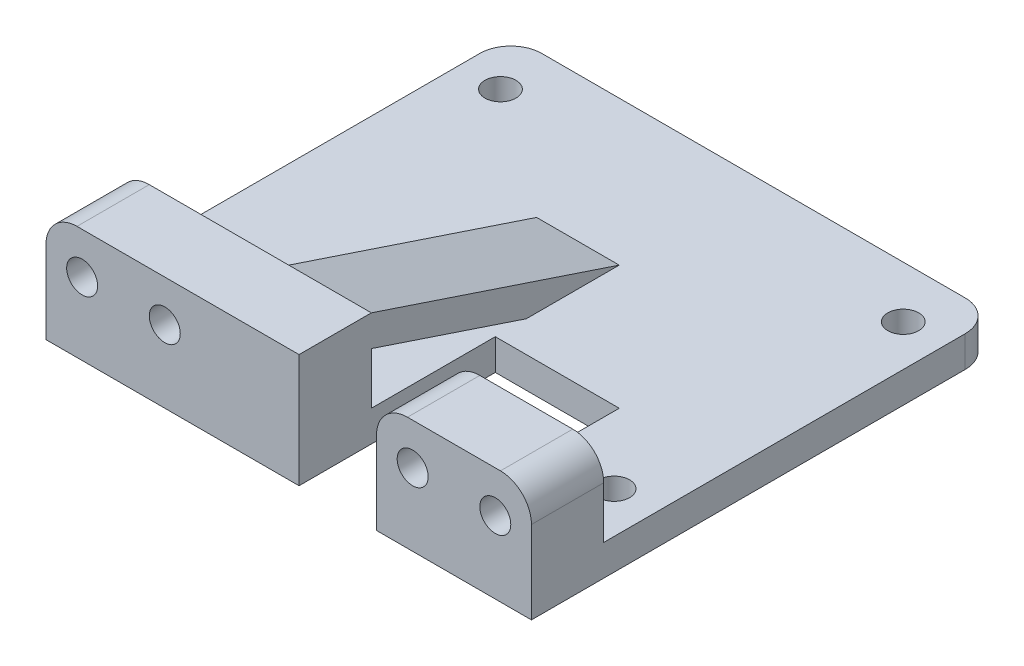
ISO-10303-21;
HEADER;
FILE_DESCRIPTION(('STEP AP214'),'2;1');
FILE_NAME('part.step','',(''),(''),'','','');
FILE_SCHEMA(('AUTOMOTIVE_DESIGN { 1 0 10303 214 1 1 1 1 }'));
ENDSEC;
DATA;
#1=APPLICATION_CONTEXT('core data for automotive mechanical design processes');
#2=APPLICATION_PROTOCOL_DEFINITION('international standard','automotive_design',2000,#1);
#3=PRODUCT_CONTEXT('',#1,'mechanical');
#4=PRODUCT('Part','Part','',(#3));
#5=PRODUCT_RELATED_PRODUCT_CATEGORY('part','',(#4));
#6=PRODUCT_DEFINITION_FORMATION('','',#4);
#7=PRODUCT_DEFINITION_CONTEXT('part definition',#1,'design');
#8=PRODUCT_DEFINITION('design','',#6,#7);
#9=PRODUCT_DEFINITION_SHAPE('','',#8);
#10=(LENGTH_UNIT() NAMED_UNIT(*) SI_UNIT(.MILLI.,.METRE.));
#11=(NAMED_UNIT(*) PLANE_ANGLE_UNIT() SI_UNIT($,.RADIAN.));
#12=(NAMED_UNIT(*) SI_UNIT($,.STERADIAN.) SOLID_ANGLE_UNIT());
#13=UNCERTAINTY_MEASURE_WITH_UNIT(LENGTH_MEASURE(1.E-05),#10,'distance_accuracy_value','');
#14=(GEOMETRIC_REPRESENTATION_CONTEXT(3) GLOBAL_UNCERTAINTY_ASSIGNED_CONTEXT((#13)) GLOBAL_UNIT_ASSIGNED_CONTEXT((#10,
#11,#12)) REPRESENTATION_CONTEXT('',''));
#15=CARTESIAN_POINT('',(0.,0.,0.));
#16=DIRECTION('',(0.,0.,1.));
#17=DIRECTION('',(1.,0.,0.));
#18=AXIS2_PLACEMENT_3D('',#15,#16,#17);
#19=CARTESIAN_POINT('',(0.,3.,7.));
#20=DIRECTION('',(0.,0.,-1.));
#21=DIRECTION('',(-1.,0.,0.));
#22=AXIS2_PLACEMENT_3D('',#19,#20,#21);
#23=PLANE('',#22);
#24=DIRECTION('',(1.,0.,0.));
#25=VECTOR('',#24,1.);
#26=CARTESIAN_POINT('',(0.,0.,7.));
#27=LINE('',#26,#25);
#28=CARTESIAN_POINT('',(0.999999999999999,0.,7.));
#29=VERTEX_POINT('',#28);
#30=CARTESIAN_POINT('',(13.,0.,7.));
#31=VERTEX_POINT('',#30);
#32=EDGE_CURVE('E307',#29,#31,#27,.T.);
#33=ORIENTED_EDGE('',*,*,#32,.T.);
#34=DIRECTION('',(0.,-1.,0.));
#35=VECTOR('',#34,1.);
#36=CARTESIAN_POINT('',(13.,3.,7.));
#37=LINE('',#36,#35);
#38=CARTESIAN_POINT('',(13.,3.,7.));
#39=VERTEX_POINT('',#38);
#40=EDGE_CURVE('E340',#39,#31,#37,.T.);
#41=ORIENTED_EDGE('',*,*,#40,.F.);
#42=DIRECTION('',(1.,0.,0.));
#43=VECTOR('',#42,1.);
#44=CARTESIAN_POINT('',(0.,3.,7.));
#45=LINE('',#44,#43);
#46=CARTESIAN_POINT('',(0.999999999999999,3.,7.));
#47=VERTEX_POINT('',#46);
#48=EDGE_CURVE('E263',#47,#39,#45,.T.);
#49=ORIENTED_EDGE('',*,*,#48,.F.);
#50=DIRECTION('',(0.,-1.,0.));
#51=VECTOR('',#50,1.);
#52=CARTESIAN_POINT('',(0.999999999999999,3.,7.));
#53=LINE('',#52,#51);
#54=EDGE_CURVE('E299',#47,#29,#53,.T.);
#55=ORIENTED_EDGE('',*,*,#54,.T.);
#56=EDGE_LOOP('',(#33,#41,#49,#55));
#57=FACE_BOUND('',#56,.T.);
#58=ADVANCED_FACE('F45',(#57),#23,.F.);
#59=CARTESIAN_POINT('',(13.,3.,0.));
#60=DIRECTION('',(1.,0.,0.));
#61=DIRECTION('',(0.,0.,-1.));
#62=AXIS2_PLACEMENT_3D('',#59,#60,#61);
#63=PLANE('',#62);
#64=DIRECTION('',(0.,0.,1.));
#65=VECTOR('',#64,1.);
#66=CARTESIAN_POINT('',(13.,0.,0.));
#67=LINE('',#66,#65);
#68=CARTESIAN_POINT('',(13.,0.,16.));
#69=VERTEX_POINT('',#68);
#70=EDGE_CURVE('E311',#31,#69,#67,.T.);
#71=ORIENTED_EDGE('',*,*,#70,.T.);
#72=DIRECTION('',(0.,-1.,0.));
#73=VECTOR('',#72,1.);
#74=CARTESIAN_POINT('',(13.,3.,16.));
#75=LINE('',#74,#73);
#76=CARTESIAN_POINT('',(13.,3.,16.));
#77=VERTEX_POINT('',#76);
#78=EDGE_CURVE('E374',#69,#77,#75,.F.);
#79=ORIENTED_EDGE('',*,*,#78,.T.);
#80=DIRECTION('',(0.,0.,1.));
#81=VECTOR('',#80,1.);
#82=CARTESIAN_POINT('',(13.,3.,0.));
#83=LINE('',#82,#81);
#84=EDGE_CURVE('E267',#39,#77,#83,.T.);
#85=ORIENTED_EDGE('',*,*,#84,.F.);
#86=ORIENTED_EDGE('',*,*,#40,.T.);
#87=EDGE_LOOP('',(#71,#79,#85,#86));
#88=FACE_BOUND('',#87,.T.);
#89=ADVANCED_FACE('F590',(#88),#63,.F.);
#90=CARTESIAN_POINT('',(23.5,3.,0.));
#91=DIRECTION('',(-1.,0.,0.));
#92=DIRECTION('',(0.,0.,1.));
#93=AXIS2_PLACEMENT_3D('',#90,#91,#92);
#94=PLANE('',#93);
#95=DIRECTION('',(0.,-1.,0.));
#96=VECTOR('',#95,1.);
#97=CARTESIAN_POINT('',(23.5,0.,19.));
#98=LINE('',#97,#96);
#99=CARTESIAN_POINT('',(23.5,8.,19.));
#100=VERTEX_POINT('',#99);
#101=CARTESIAN_POINT('',(23.5,3.,19.));
#102=VERTEX_POINT('',#101);
#103=EDGE_CURVE('E459',#100,#102,#98,.T.);
#104=ORIENTED_EDGE('',*,*,#103,.F.);
#105=DIRECTION('',(0.,0.,-1.));
#106=VECTOR('',#105,1.);
#107=CARTESIAN_POINT('',(23.5,8.,26.));
#108=LINE('',#107,#106);
#109=CARTESIAN_POINT('',(23.5,8.,26.));
#110=VERTEX_POINT('',#109);
#111=EDGE_CURVE('E11',#100,#110,#108,.F.);
#112=ORIENTED_EDGE('',*,*,#111,.T.);
#113=DIRECTION('',(0.,-1.,0.));
#114=VECTOR('',#113,1.);
#115=CARTESIAN_POINT('',(23.5,0.,26.));
#116=LINE('',#115,#114);
#117=CARTESIAN_POINT('',(23.5,0.,26.));
#118=VERTEX_POINT('',#117);
#119=EDGE_CURVE('E466',#110,#118,#116,.T.);
#120=ORIENTED_EDGE('',*,*,#119,.T.);
#121=DIRECTION('',(0.,0.,-1.));
#122=VECTOR('',#121,1.);
#123=CARTESIAN_POINT('',(23.5,0.,0.));
#124=LINE('',#123,#122);
#125=CARTESIAN_POINT('',(23.5,0.,-16.));
#126=VERTEX_POINT('',#125);
#127=EDGE_CURVE('E315',#118,#126,#124,.T.);
#128=ORIENTED_EDGE('',*,*,#127,.T.);
#129=DIRECTION('',(0.,-1.,0.));
#130=VECTOR('',#129,1.);
#131=CARTESIAN_POINT('',(23.5,3.,-16.));
#132=LINE('',#131,#130);
#133=CARTESIAN_POINT('',(23.5,3.,-16.));
#134=VERTEX_POINT('',#133);
#135=EDGE_CURVE('E357',#126,#134,#132,.F.);
#136=ORIENTED_EDGE('',*,*,#135,.T.);
#137=DIRECTION('',(0.,0.,-1.));
#138=VECTOR('',#137,1.);
#139=CARTESIAN_POINT('',(23.5,3.,0.));
#140=LINE('',#139,#138);
#141=EDGE_CURVE('E275',#102,#134,#140,.T.);
#142=ORIENTED_EDGE('',*,*,#141,.F.);
#143=EDGE_LOOP('',(#104,#112,#120,#128,#136,#142));
#144=FACE_BOUND('',#143,.T.);
#145=ADVANCED_FACE('F582',(#144),#94,.F.);
#146=CARTESIAN_POINT('',(0.,3.,-19.));
#147=DIRECTION('',(0.,0.,-1.));
#148=DIRECTION('',(-1.,0.,0.));
#149=AXIS2_PLACEMENT_3D('',#146,#147,#148);
#150=PLANE('',#149);
#151=DIRECTION('',(1.,0.,0.));
#152=VECTOR('',#151,1.);
#153=CARTESIAN_POINT('',(0.,3.,-19.));
#154=LINE('',#153,#152);
#155=CARTESIAN_POINT('',(-20.5,3.,-19.));
#156=VERTEX_POINT('',#155);
#157=CARTESIAN_POINT('',(20.5,3.,-19.));
#158=VERTEX_POINT('',#157);
#159=EDGE_CURVE('E280',#156,#158,#154,.T.);
#160=ORIENTED_EDGE('',*,*,#159,.T.);
#161=DIRECTION('',(0.,-1.,0.));
#162=VECTOR('',#161,1.);
#163=CARTESIAN_POINT('',(20.5,0.,-19.));
#164=LINE('',#163,#162);
#165=CARTESIAN_POINT('',(20.5,0.,-19.));
#166=VERTEX_POINT('',#165);
#167=EDGE_CURVE('E347',#158,#166,#164,.T.);
#168=ORIENTED_EDGE('',*,*,#167,.T.);
#169=DIRECTION('',(1.,0.,0.));
#170=VECTOR('',#169,1.);
#171=CARTESIAN_POINT('',(0.,0.,-19.));
#172=LINE('',#171,#170);
#173=CARTESIAN_POINT('',(-20.5,0.,-19.));
#174=VERTEX_POINT('',#173);
#175=EDGE_CURVE('E319',#174,#166,#172,.T.);
#176=ORIENTED_EDGE('',*,*,#175,.F.);
#177=DIRECTION('',(0.,-1.,0.));
#178=VECTOR('',#177,1.);
#179=CARTESIAN_POINT('',(-20.5,3.,-19.));
#180=LINE('',#179,#178);
#181=EDGE_CURVE('E344',#174,#156,#180,.F.);
#182=ORIENTED_EDGE('',*,*,#181,.T.);
#183=EDGE_LOOP('',(#160,#168,#176,#182));
#184=FACE_BOUND('',#183,.T.);
#185=ADVANCED_FACE('F575',(#184),#150,.T.);
#186=CARTESIAN_POINT('',(-23.5,3.,0.));
#187=DIRECTION('',(-1.,0.,0.));
#188=DIRECTION('',(0.,0.,1.));
#189=AXIS2_PLACEMENT_3D('',#186,#187,#188);
#190=PLANE('',#189);
#191=DIRECTION('',(0.,1.,0.));
#192=VECTOR('',#191,1.);
#193=CARTESIAN_POINT('',(-23.5,0.,26.));
#194=LINE('',#193,#192);
#195=CARTESIAN_POINT('',(-23.5,0.,26.));
#196=VERTEX_POINT('',#195);
#197=CARTESIAN_POINT('',(-23.5,8.,26.));
#198=VERTEX_POINT('',#197);
#199=EDGE_CURVE('E249',#196,#198,#194,.T.);
#200=ORIENTED_EDGE('',*,*,#199,.T.);
#201=DIRECTION('',(0.,0.,-1.));
#202=VECTOR('',#201,1.);
#203=CARTESIAN_POINT('',(-23.5,8.,19.));
#204=LINE('',#203,#202);
#205=CARTESIAN_POINT('',(-23.5,8.,19.));
#206=VERTEX_POINT('',#205);
#207=EDGE_CURVE('E384',#198,#206,#204,.T.);
#208=ORIENTED_EDGE('',*,*,#207,.T.);
#209=DIRECTION('',(0.,1.,0.));
#210=VECTOR('',#209,1.);
#211=CARTESIAN_POINT('',(-23.5,0.,19.));
#212=LINE('',#211,#210);
#213=CARTESIAN_POINT('',(-23.5,3.,19.));
#214=VERTEX_POINT('',#213);
#215=EDGE_CURVE('E465',#214,#206,#212,.T.);
#216=ORIENTED_EDGE('',*,*,#215,.F.);
#217=DIRECTION('',(0.,0.,-1.));
#218=VECTOR('',#217,1.);
#219=CARTESIAN_POINT('',(-23.5,3.,0.));
#220=LINE('',#219,#218);
#221=CARTESIAN_POINT('',(-23.5,3.,-16.));
#222=VERTEX_POINT('',#221);
#223=EDGE_CURVE('E284',#214,#222,#220,.T.);
#224=ORIENTED_EDGE('',*,*,#223,.T.);
#225=DIRECTION('',(0.,-1.,0.));
#226=VECTOR('',#225,1.);
#227=CARTESIAN_POINT('',(-23.5,3.,-16.));
#228=LINE('',#227,#226);
#229=CARTESIAN_POINT('',(-23.5,0.,-16.));
#230=VERTEX_POINT('',#229);
#231=EDGE_CURVE('E366',#222,#230,#228,.T.);
#232=ORIENTED_EDGE('',*,*,#231,.T.);
#233=DIRECTION('',(0.,0.,-1.));
#234=VECTOR('',#233,1.);
#235=CARTESIAN_POINT('',(-23.5,0.,0.));
#236=LINE('',#235,#234);
#237=EDGE_CURVE('E323',#196,#230,#236,.T.);
#238=ORIENTED_EDGE('',*,*,#237,.F.);
#239=EDGE_LOOP('',(#200,#208,#216,#224,#232,#238));
#240=FACE_BOUND('',#239,.T.);
#241=ADVANCED_FACE('F554',(#240),#190,.T.);
#242=CARTESIAN_POINT('',(-19.5,3.,14.));
#243=DIRECTION('',(0.,-1.,0.));
#244=DIRECTION('',(0.,0.,-1.));
#245=AXIS2_PLACEMENT_3D('',#242,#243,#244);
#246=CYLINDRICAL_SURFACE('',#245,1.5);
#247=CARTESIAN_POINT('',(-19.5,3.,14.));
#248=DIRECTION('',(0.,1.,0.));
#249=DIRECTION('',(0.,0.,1.));
#250=AXIS2_PLACEMENT_3D('',#247,#248,#249);
#251=CIRCLE('',#250,1.5);
#252=CARTESIAN_POINT('',(-19.5,3.,15.5));
#253=VERTEX_POINT('',#252);
#254=EDGE_CURVE('E291',#253,#253,#251,.T.);
#255=ORIENTED_EDGE('',*,*,#254,.T.);
#256=EDGE_LOOP('',(#255));
#257=FACE_BOUND('',#256,.T.);
#258=CARTESIAN_POINT('',(-19.5,0.,14.));
#259=DIRECTION('',(0.,1.,0.));
#260=DIRECTION('',(0.,0.,1.));
#261=AXIS2_PLACEMENT_3D('',#258,#259,#260);
#262=CIRCLE('',#261,1.5);
#263=CARTESIAN_POINT('',(-19.5,0.,15.5));
#264=VERTEX_POINT('',#263);
#265=EDGE_CURVE('E330',#264,#264,#262,.T.);
#266=ORIENTED_EDGE('',*,*,#265,.F.);
#267=EDGE_LOOP('',(#266));
#268=FACE_BOUND('',#267,.T.);
#269=ADVANCED_FACE('F668',(#257,#268),#246,.F.);
#270=CARTESIAN_POINT('',(0.999999999999999,3.,0.));
#271=DIRECTION('',(-1.,0.,0.));
#272=DIRECTION('',(0.,0.,1.));
#273=AXIS2_PLACEMENT_3D('',#270,#271,#272);
#274=PLANE('',#273);
#275=DIRECTION('',(0.,0.,-1.));
#276=VECTOR('',#275,1.);
#277=CARTESIAN_POINT('',(0.999999999999999,0.,0.));
#278=LINE('',#277,#276);
#279=CARTESIAN_POINT('',(0.999999999999999,0.,26.));
#280=VERTEX_POINT('',#279);
#281=EDGE_CURVE('E327',#280,#29,#278,.T.);
#282=ORIENTED_EDGE('',*,*,#281,.T.);
#283=ORIENTED_EDGE('',*,*,#54,.F.);
#284=DIRECTION('',(0.,0.,-1.));
#285=VECTOR('',#284,1.);
#286=CARTESIAN_POINT('',(0.999999999999999,3.,0.));
#287=LINE('',#286,#285);
#288=CARTESIAN_POINT('',(0.999999999999999,3.,19.));
#289=VERTEX_POINT('',#288);
#290=EDGE_CURVE('E288',#289,#47,#287,.T.);
#291=ORIENTED_EDGE('',*,*,#290,.F.);
#292=DIRECTION('',(0.,1.,0.));
#293=VECTOR('',#292,1.);
#294=CARTESIAN_POINT('',(0.999999999999999,0.,19.));
#295=LINE('',#294,#293);
#296=CARTESIAN_POINT('',(0.999999999999999,8.,19.));
#297=VERTEX_POINT('',#296);
#298=EDGE_CURVE('E231',#289,#297,#295,.T.);
#299=ORIENTED_EDGE('',*,*,#298,.T.);
#300=DIRECTION('',(0.,-0.316227766016838,-0.948683298050514));
#301=VECTOR('',#300,1.);
#302=CARTESIAN_POINT('',(0.999999999999999,3.,3.99999999999998));
#303=LINE('',#302,#301);
#304=CARTESIAN_POINT('',(0.999999999999999,3.,3.99999999999998));
#305=VERTEX_POINT('',#304);
#306=EDGE_CURVE('E497',#297,#305,#303,.T.);
#307=ORIENTED_EDGE('',*,*,#306,.T.);
#308=DIRECTION('',(0.,0.,-1.));
#309=VECTOR('',#308,1.);
#310=CARTESIAN_POINT('',(0.999999999999999,3.,-5.00000000000002));
#311=LINE('',#310,#309);
#312=CARTESIAN_POINT('',(0.999999999999999,3.,-5.00000000000002));
#313=VERTEX_POINT('',#312);
#314=EDGE_CURVE('E220',#305,#313,#311,.T.);
#315=ORIENTED_EDGE('',*,*,#314,.T.);
#316=DIRECTION('',(0.,0.316227766016838,0.948683298050514));
#317=VECTOR('',#316,1.);
#318=CARTESIAN_POINT('',(0.999999999999999,11.,19.));
#319=LINE('',#318,#317);
#320=CARTESIAN_POINT('',(0.999999999999999,11.,19.));
#321=VERTEX_POINT('',#320);
#322=EDGE_CURVE('E536',#313,#321,#319,.T.);
#323=ORIENTED_EDGE('',*,*,#322,.T.);
#324=DIRECTION('',(0.,0.,-1.));
#325=VECTOR('',#324,1.);
#326=CARTESIAN_POINT('',(0.999999999999999,11.,26.));
#327=LINE('',#326,#325);
#328=CARTESIAN_POINT('',(0.999999999999999,11.,26.));
#329=VERTEX_POINT('',#328);
#330=EDGE_CURVE('E236',#329,#321,#327,.T.);
#331=ORIENTED_EDGE('',*,*,#330,.F.);
#332=DIRECTION('',(0.,1.,0.));
#333=VECTOR('',#332,1.);
#334=CARTESIAN_POINT('',(0.999999999999999,0.,26.));
#335=LINE('',#334,#333);
#336=EDGE_CURVE('E474',#280,#329,#335,.T.);
#337=ORIENTED_EDGE('',*,*,#336,.F.);
#338=EDGE_LOOP('',(#282,#283,#291,#299,#307,#315,#323,#331,#337));
#339=FACE_BOUND('',#338,.T.);
#340=ADVANCED_FACE('F495',(#339),#274,.F.);
#341=CARTESIAN_POINT('',(19.5,3.,-14.));
#342=DIRECTION('',(0.,-1.,0.));
#343=DIRECTION('',(0.,0.,-1.));
#344=AXIS2_PLACEMENT_3D('',#341,#342,#343);
#345=CYLINDRICAL_SURFACE('',#344,1.5);
#346=CARTESIAN_POINT('',(19.5,3.,-14.));
#347=DIRECTION('',(0.,1.,0.));
#348=DIRECTION('',(0.,0.,1.));
#349=AXIS2_PLACEMENT_3D('',#346,#347,#348);
#350=CIRCLE('',#349,1.5);
#351=CARTESIAN_POINT('',(19.5,3.,-12.5));
#352=VERTEX_POINT('',#351);
#353=EDGE_CURVE('E258',#352,#352,#350,.T.);
#354=ORIENTED_EDGE('',*,*,#353,.T.);
#355=EDGE_LOOP('',(#354));
#356=FACE_BOUND('',#355,.T.);
#357=CARTESIAN_POINT('',(19.5,0.,-14.));
#358=DIRECTION('',(0.,1.,0.));
#359=DIRECTION('',(0.,0.,1.));
#360=AXIS2_PLACEMENT_3D('',#357,#358,#359);
#361=CIRCLE('',#360,1.5);
#362=CARTESIAN_POINT('',(19.5,0.,-12.5));
#363=VERTEX_POINT('',#362);
#364=EDGE_CURVE('E303',#363,#363,#361,.T.);
#365=ORIENTED_EDGE('',*,*,#364,.F.);
#366=EDGE_LOOP('',(#365));
#367=FACE_BOUND('',#366,.T.);
#368=ADVANCED_FACE('F609',(#356,#367),#345,.F.);
#369=CARTESIAN_POINT('',(19.5,3.,14.));
#370=DIRECTION('',(0.,-1.,0.));
#371=DIRECTION('',(0.,0.,-1.));
#372=AXIS2_PLACEMENT_3D('',#369,#370,#371);
#373=CYLINDRICAL_SURFACE('',#372,1.5);
#374=CARTESIAN_POINT('',(19.5,3.,14.));
#375=DIRECTION('',(0.,1.,0.));
#376=DIRECTION('',(0.,0.,1.));
#377=AXIS2_PLACEMENT_3D('',#374,#375,#376);
#378=CIRCLE('',#377,1.5);
#379=CARTESIAN_POINT('',(19.5,3.,15.5));
#380=VERTEX_POINT('',#379);
#381=EDGE_CURVE('E254',#380,#380,#378,.F.);
#382=ORIENTED_EDGE('',*,*,#381,.F.);
#383=EDGE_LOOP('',(#382));
#384=FACE_BOUND('',#383,.T.);
#385=CARTESIAN_POINT('',(19.5,0.,14.));
#386=DIRECTION('',(0.,1.,0.));
#387=DIRECTION('',(0.,0.,1.));
#388=AXIS2_PLACEMENT_3D('',#385,#386,#387);
#389=CIRCLE('',#388,1.5);
#390=CARTESIAN_POINT('',(19.5,0.,15.5));
#391=VERTEX_POINT('',#390);
#392=EDGE_CURVE('E252',#391,#391,#389,.F.);
#393=ORIENTED_EDGE('',*,*,#392,.T.);
#394=EDGE_LOOP('',(#393));
#395=FACE_BOUND('',#394,.T.);
#396=ADVANCED_FACE('F612',(#384,#395),#373,.F.);
#397=CARTESIAN_POINT('',(-19.5,3.,-14.));
#398=DIRECTION('',(0.,-1.,0.));
#399=DIRECTION('',(0.,0.,-1.));
#400=AXIS2_PLACEMENT_3D('',#397,#398,#399);
#401=CYLINDRICAL_SURFACE('',#400,1.5);
#402=CARTESIAN_POINT('',(-19.5,3.,-14.));
#403=DIRECTION('',(0.,1.,0.));
#404=DIRECTION('',(0.,0.,1.));
#405=AXIS2_PLACEMENT_3D('',#402,#403,#404);
#406=CIRCLE('',#405,1.5);
#407=CARTESIAN_POINT('',(-19.5,3.,-12.5));
#408=VERTEX_POINT('',#407);
#409=EDGE_CURVE('E295',#408,#408,#406,.F.);
#410=ORIENTED_EDGE('',*,*,#409,.F.);
#411=EDGE_LOOP('',(#410));
#412=FACE_BOUND('',#411,.T.);
#413=CARTESIAN_POINT('',(-19.5,0.,-14.));
#414=DIRECTION('',(0.,1.,0.));
#415=DIRECTION('',(0.,0.,1.));
#416=AXIS2_PLACEMENT_3D('',#413,#414,#415);
#417=CIRCLE('',#416,1.5);
#418=CARTESIAN_POINT('',(-19.5,0.,-12.5));
#419=VERTEX_POINT('',#418);
#420=EDGE_CURVE('E259',#419,#419,#417,.F.);
#421=ORIENTED_EDGE('',*,*,#420,.T.);
#422=EDGE_LOOP('',(#421));
#423=FACE_BOUND('',#422,.T.);
#424=ADVANCED_FACE('F616',(#412,#423),#401,.F.);
#425=CARTESIAN_POINT('',(0.,3.,0.));
#426=DIRECTION('',(0.,1.,0.));
#427=DIRECTION('',(0.,0.,1.));
#428=AXIS2_PLACEMENT_3D('',#425,#426,#427);
#429=PLANE('',#428);
#430=DIRECTION('',(0.,0.,-1.));
#431=VECTOR('',#430,1.);
#432=CARTESIAN_POINT('',(-7.,3.,-5.00000000000002));
#433=LINE('',#432,#431);
#434=CARTESIAN_POINT('',(-7.,3.,3.99999999999998));
#435=VERTEX_POINT('',#434);
#436=CARTESIAN_POINT('',(-7.,3.,-5.00000000000002));
#437=VERTEX_POINT('',#436);
#438=EDGE_CURVE('E504',#435,#437,#433,.T.);
#439=ORIENTED_EDGE('',*,*,#438,.T.);
#440=DIRECTION('',(1.,0.,0.));
#441=VECTOR('',#440,1.);
#442=CARTESIAN_POINT('',(-7.,3.,-5.00000000000002));
#443=LINE('',#442,#441);
#444=EDGE_CURVE('E218',#437,#313,#443,.T.);
#445=ORIENTED_EDGE('',*,*,#444,.T.);
#446=ORIENTED_EDGE('',*,*,#314,.F.);
#447=DIRECTION('',(1.,0.,0.));
#448=VECTOR('',#447,1.);
#449=CARTESIAN_POINT('',(-7.,3.,3.99999999999998));
#450=LINE('',#449,#448);
#451=EDGE_CURVE('E503',#435,#305,#450,.T.);
#452=ORIENTED_EDGE('',*,*,#451,.F.);
#453=EDGE_LOOP('',(#439,#445,#446,#452));
#454=FACE_BOUND('',#453,.T.);
#455=ORIENTED_EDGE('',*,*,#381,.T.);
#456=EDGE_LOOP('',(#455));
#457=FACE_BOUND('',#456,.T.);
#458=ORIENTED_EDGE('',*,*,#353,.F.);
#459=EDGE_LOOP('',(#458));
#460=FACE_BOUND('',#459,.T.);
#461=ORIENTED_EDGE('',*,*,#141,.T.);
#462=CARTESIAN_POINT('',(20.5,3.,-16.));
#463=DIRECTION('',(0.,1.,0.));
#464=DIRECTION('',(0.,0.,1.));
#465=AXIS2_PLACEMENT_3D('',#462,#463,#464);
#466=CIRCLE('',#465,3.);
#467=EDGE_CURVE('E363',#134,#158,#466,.T.);
#468=ORIENTED_EDGE('',*,*,#467,.T.);
#469=ORIENTED_EDGE('',*,*,#159,.F.);
#470=CARTESIAN_POINT('',(-20.5,3.,-16.));
#471=DIRECTION('',(0.,1.,0.));
#472=DIRECTION('',(0.,0.,1.));
#473=AXIS2_PLACEMENT_3D('',#470,#471,#472);
#474=CIRCLE('',#473,3.);
#475=EDGE_CURVE('E360',#156,#222,#474,.T.);
#476=ORIENTED_EDGE('',*,*,#475,.T.);
#477=ORIENTED_EDGE('',*,*,#223,.F.);
#478=DIRECTION('',(1.,0.,0.));
#479=VECTOR('',#478,1.);
#480=CARTESIAN_POINT('',(0.,3.,19.));
#481=LINE('',#480,#479);
#482=EDGE_CURVE('E276',#214,#289,#481,.T.);
#483=ORIENTED_EDGE('',*,*,#482,.T.);
#484=ORIENTED_EDGE('',*,*,#290,.T.);
#485=ORIENTED_EDGE('',*,*,#48,.T.);
#486=ORIENTED_EDGE('',*,*,#84,.T.);
#487=CARTESIAN_POINT('',(10.,3.,16.));
#488=DIRECTION('',(0.,1.,0.));
#489=DIRECTION('',(0.,0.,1.));
#490=AXIS2_PLACEMENT_3D('',#487,#488,#489);
#491=CIRCLE('',#490,3.);
#492=CARTESIAN_POINT('',(10.,3.,19.));
#493=VERTEX_POINT('',#492);
#494=EDGE_CURVE('E380',#77,#493,#491,.F.);
#495=ORIENTED_EDGE('',*,*,#494,.T.);
#496=EDGE_CURVE('E271',#493,#102,#481,.T.);
#497=ORIENTED_EDGE('',*,*,#496,.T.);
#498=EDGE_LOOP('',(#461,#468,#469,#476,#477,#483,#484,#485,#486,#495,#497));
#499=FACE_BOUND('',#498,.T.);
#500=ORIENTED_EDGE('',*,*,#254,.F.);
#501=EDGE_LOOP('',(#500));
#502=FACE_BOUND('',#501,.T.);
#503=ORIENTED_EDGE('',*,*,#409,.T.);
#504=EDGE_LOOP('',(#503));
#505=FACE_BOUND('',#504,.T.);
#506=ADVANCED_FACE('F542',(#454,#457,#460,#499,#502,#505),#429,.T.);
#507=CARTESIAN_POINT('',(0.,0.,0.));
#508=DIRECTION('',(0.,1.,0.));
#509=DIRECTION('',(0.,0.,1.));
#510=AXIS2_PLACEMENT_3D('',#507,#508,#509);
#511=PLANE('',#510);
#512=ORIENTED_EDGE('',*,*,#392,.F.);
#513=EDGE_LOOP('',(#512));
#514=FACE_BOUND('',#513,.T.);
#515=ORIENTED_EDGE('',*,*,#364,.T.);
#516=EDGE_LOOP('',(#515));
#517=FACE_BOUND('',#516,.T.);
#518=ORIENTED_EDGE('',*,*,#175,.T.);
#519=CARTESIAN_POINT('',(20.5,0.,-16.));
#520=DIRECTION('',(0.,1.,0.));
#521=DIRECTION('',(0.,0.,1.));
#522=AXIS2_PLACEMENT_3D('',#519,#520,#521);
#523=CIRCLE('',#522,3.);
#524=EDGE_CURVE('E354',#166,#126,#523,.F.);
#525=ORIENTED_EDGE('',*,*,#524,.T.);
#526=ORIENTED_EDGE('',*,*,#127,.F.);
#527=DIRECTION('',(-1.,0.,0.));
#528=VECTOR('',#527,1.);
#529=CARTESIAN_POINT('',(0.,0.,26.));
#530=LINE('',#529,#528);
#531=CARTESIAN_POINT('',(8.50000000000001,0.,26.));
#532=VERTEX_POINT('',#531);
#533=EDGE_CURVE('E433',#118,#532,#530,.T.);
#534=ORIENTED_EDGE('',*,*,#533,.T.);
#535=DIRECTION('',(0.,0.,-1.));
#536=VECTOR('',#535,1.);
#537=CARTESIAN_POINT('',(8.50000000000001,0.,26.));
#538=LINE('',#537,#536);
#539=CARTESIAN_POINT('',(8.50000000000001,0.,19.));
#540=VERTEX_POINT('',#539);
#541=EDGE_CURVE('E431',#532,#540,#538,.T.);
#542=ORIENTED_EDGE('',*,*,#541,.T.);
#543=DIRECTION('',(-1.,0.,0.));
#544=VECTOR('',#543,1.);
#545=CARTESIAN_POINT('',(0.,0.,19.));
#546=LINE('',#545,#544);
#547=CARTESIAN_POINT('',(10.,0.,19.));
#548=VERTEX_POINT('',#547);
#549=EDGE_CURVE('E450',#548,#540,#546,.T.);
#550=ORIENTED_EDGE('',*,*,#549,.F.);
#551=CARTESIAN_POINT('',(10.,0.,16.));
#552=DIRECTION('',(0.,1.,0.));
#553=DIRECTION('',(0.,0.,1.));
#554=AXIS2_PLACEMENT_3D('',#551,#552,#553);
#555=CIRCLE('',#554,3.);
#556=EDGE_CURVE('E377',#548,#69,#555,.T.);
#557=ORIENTED_EDGE('',*,*,#556,.T.);
#558=ORIENTED_EDGE('',*,*,#70,.F.);
#559=ORIENTED_EDGE('',*,*,#32,.F.);
#560=ORIENTED_EDGE('',*,*,#281,.F.);
#561=DIRECTION('',(1.,0.,0.));
#562=VECTOR('',#561,1.);
#563=CARTESIAN_POINT('',(0.,0.,26.));
#564=LINE('',#563,#562);
#565=EDGE_CURVE('E470',#196,#280,#564,.T.);
#566=ORIENTED_EDGE('',*,*,#565,.F.);
#567=ORIENTED_EDGE('',*,*,#237,.T.);
#568=CARTESIAN_POINT('',(-20.5,0.,-16.));
#569=DIRECTION('',(0.,1.,0.));
#570=DIRECTION('',(0.,0.,1.));
#571=AXIS2_PLACEMENT_3D('',#568,#569,#570);
#572=CIRCLE('',#571,3.);
#573=EDGE_CURVE('E351',#230,#174,#572,.F.);
#574=ORIENTED_EDGE('',*,*,#573,.T.);
#575=EDGE_LOOP('',(#518,#525,#526,#534,#542,#550,#557,#558,#559,#560,#566,#567,#574));
#576=FACE_BOUND('',#575,.T.);
#577=ORIENTED_EDGE('',*,*,#265,.T.);
#578=EDGE_LOOP('',(#577));
#579=FACE_BOUND('',#578,.T.);
#580=ORIENTED_EDGE('',*,*,#420,.F.);
#581=EDGE_LOOP('',(#580));
#582=FACE_BOUND('',#581,.T.);
#583=ADVANCED_FACE('F557',(#514,#517,#576,#579,#582),#511,.F.);
#584=CARTESIAN_POINT('',(-20.,7.,26.));
#585=DIRECTION('',(0.,0.,-1.));
#586=DIRECTION('',(-1.,0.,0.));
#587=AXIS2_PLACEMENT_3D('',#584,#585,#586);
#588=CYLINDRICAL_SURFACE('',#587,1.5);
#589=CARTESIAN_POINT('',(-20.,7.,26.));
#590=DIRECTION('',(0.,0.,1.));
#591=DIRECTION('',(1.,0.,0.));
#592=AXIS2_PLACEMENT_3D('',#589,#590,#591);
#593=CIRCLE('',#592,1.5);
#594=CARTESIAN_POINT('',(-18.5,7.,26.));
#595=VERTEX_POINT('',#594);
#596=EDGE_CURVE('E481',#595,#595,#593,.F.);
#597=ORIENTED_EDGE('',*,*,#596,.F.);
#598=EDGE_LOOP('',(#597));
#599=FACE_BOUND('',#598,.T.);
#600=CARTESIAN_POINT('',(-20.,7.,19.));
#601=DIRECTION('',(0.,0.,1.));
#602=DIRECTION('',(1.,0.,0.));
#603=AXIS2_PLACEMENT_3D('',#600,#601,#602);
#604=CIRCLE('',#603,1.5);
#605=CARTESIAN_POINT('',(-18.5,7.,19.));
#606=VERTEX_POINT('',#605);
#607=EDGE_CURVE('E238',#606,#606,#604,.F.);
#608=ORIENTED_EDGE('',*,*,#607,.T.);
#609=EDGE_LOOP('',(#608));
#610=FACE_BOUND('',#609,.T.);
#611=ADVANCED_FACE('F654',(#599,#610),#588,.F.);
#612=CARTESIAN_POINT('',(0.,11.,26.));
#613=DIRECTION('',(0.,-1.,0.));
#614=DIRECTION('',(0.,0.,-1.));
#615=AXIS2_PLACEMENT_3D('',#612,#613,#614);
#616=PLANE('',#615);
#617=DIRECTION('',(-1.,0.,0.));
#618=VECTOR('',#617,1.);
#619=CARTESIAN_POINT('',(0.,11.,19.));
#620=LINE('',#619,#618);
#621=CARTESIAN_POINT('',(-7.,11.,19.));
#622=VERTEX_POINT('',#621);
#623=CARTESIAN_POINT('',(-20.5,11.,19.));
#624=VERTEX_POINT('',#623);
#625=EDGE_CURVE('E223',#622,#624,#620,.T.);
#626=ORIENTED_EDGE('',*,*,#625,.T.);
#627=DIRECTION('',(0.,0.,-1.));
#628=VECTOR('',#627,1.);
#629=CARTESIAN_POINT('',(-20.5,11.,26.));
#630=LINE('',#629,#628);
#631=CARTESIAN_POINT('',(-20.5,11.,26.));
#632=VERTEX_POINT('',#631);
#633=EDGE_CURVE('E390',#624,#632,#630,.F.);
#634=ORIENTED_EDGE('',*,*,#633,.T.);
#635=DIRECTION('',(-1.,0.,0.));
#636=VECTOR('',#635,1.);
#637=CARTESIAN_POINT('',(0.,11.,26.));
#638=LINE('',#637,#636);
#639=EDGE_CURVE('E477',#329,#632,#638,.T.);
#640=ORIENTED_EDGE('',*,*,#639,.F.);
#641=ORIENTED_EDGE('',*,*,#330,.T.);
#642=EDGE_CURVE('E215',#321,#622,#620,.T.);
#643=ORIENTED_EDGE('',*,*,#642,.T.);
#644=EDGE_LOOP('',(#626,#634,#640,#641,#643));
#645=FACE_BOUND('',#644,.T.);
#646=ADVANCED_FACE('F233',(#645),#616,.F.);
#647=CARTESIAN_POINT('',(-12.,7.,26.));
#648=DIRECTION('',(0.,0.,-1.));
#649=DIRECTION('',(-1.,0.,0.));
#650=AXIS2_PLACEMENT_3D('',#647,#648,#649);
#651=CYLINDRICAL_SURFACE('',#650,1.5);
#652=CARTESIAN_POINT('',(-12.,7.,26.));
#653=DIRECTION('',(0.,0.,1.));
#654=DIRECTION('',(1.,0.,0.));
#655=AXIS2_PLACEMENT_3D('',#652,#653,#654);
#656=CIRCLE('',#655,1.5);
#657=CARTESIAN_POINT('',(-10.5,7.,26.));
#658=VERTEX_POINT('',#657);
#659=EDGE_CURVE('E253',#658,#658,#656,.F.);
#660=ORIENTED_EDGE('',*,*,#659,.F.);
#661=EDGE_LOOP('',(#660));
#662=FACE_BOUND('',#661,.T.);
#663=CARTESIAN_POINT('',(-12.,7.,19.));
#664=DIRECTION('',(0.,0.,1.));
#665=DIRECTION('',(1.,0.,0.));
#666=AXIS2_PLACEMENT_3D('',#663,#664,#665);
#667=CIRCLE('',#666,1.5);
#668=CARTESIAN_POINT('',(-10.5,7.,19.));
#669=VERTEX_POINT('',#668);
#670=EDGE_CURVE('E241',#669,#669,#667,.F.);
#671=ORIENTED_EDGE('',*,*,#670,.T.);
#672=EDGE_LOOP('',(#671));
#673=FACE_BOUND('',#672,.T.);
#674=ADVANCED_FACE('F648',(#662,#673),#651,.F.);
#675=CARTESIAN_POINT('',(0.,0.,26.));
#676=DIRECTION('',(0.,0.,1.));
#677=DIRECTION('',(1.,0.,0.));
#678=AXIS2_PLACEMENT_3D('',#675,#676,#677);
#679=PLANE('',#678);
#680=ORIENTED_EDGE('',*,*,#639,.T.);
#681=CARTESIAN_POINT('',(-20.5,8.,26.));
#682=DIRECTION('',(0.,0.,1.));
#683=DIRECTION('',(1.,0.,0.));
#684=AXIS2_PLACEMENT_3D('',#681,#682,#683);
#685=CIRCLE('',#684,3.);
#686=EDGE_CURVE('E393',#632,#198,#685,.T.);
#687=ORIENTED_EDGE('',*,*,#686,.T.);
#688=ORIENTED_EDGE('',*,*,#199,.F.);
#689=ORIENTED_EDGE('',*,*,#565,.T.);
#690=ORIENTED_EDGE('',*,*,#336,.T.);
#691=EDGE_LOOP('',(#680,#687,#688,#689,#690));
#692=FACE_BOUND('',#691,.T.);
#693=ORIENTED_EDGE('',*,*,#596,.T.);
#694=EDGE_LOOP('',(#693));
#695=FACE_BOUND('',#694,.T.);
#696=ORIENTED_EDGE('',*,*,#659,.T.);
#697=EDGE_LOOP('',(#696));
#698=FACE_BOUND('',#697,.T.);
#699=ADVANCED_FACE('F547',(#692,#695,#698),#679,.T.);
#700=CARTESIAN_POINT('',(0.,0.,19.));
#701=DIRECTION('',(0.,0.,1.));
#702=DIRECTION('',(1.,0.,0.));
#703=AXIS2_PLACEMENT_3D('',#700,#701,#702);
#704=PLANE('',#703);
#705=ORIENTED_EDGE('',*,*,#215,.T.);
#706=CARTESIAN_POINT('',(-20.5,8.,19.));
#707=DIRECTION('',(0.,0.,1.));
#708=DIRECTION('',(1.,0.,0.));
#709=AXIS2_PLACEMENT_3D('',#706,#707,#708);
#710=CIRCLE('',#709,3.);
#711=EDGE_CURVE('E227',#206,#624,#710,.F.);
#712=ORIENTED_EDGE('',*,*,#711,.T.);
#713=ORIENTED_EDGE('',*,*,#625,.F.);
#714=DIRECTION('',(0.,-1.,0.));
#715=VECTOR('',#714,1.);
#716=CARTESIAN_POINT('',(-7.,11.,19.));
#717=LINE('',#716,#715);
#718=CARTESIAN_POINT('',(-7.,8.,19.));
#719=VERTEX_POINT('',#718);
#720=EDGE_CURVE('E199',#622,#719,#717,.T.);
#721=ORIENTED_EDGE('',*,*,#720,.T.);
#722=DIRECTION('',(1.,0.,0.));
#723=VECTOR('',#722,1.);
#724=CARTESIAN_POINT('',(-7.,8.,19.));
#725=LINE('',#724,#723);
#726=EDGE_CURVE('E500',#719,#297,#725,.T.);
#727=ORIENTED_EDGE('',*,*,#726,.T.);
#728=ORIENTED_EDGE('',*,*,#298,.F.);
#729=ORIENTED_EDGE('',*,*,#482,.F.);
#730=EDGE_LOOP('',(#705,#712,#713,#721,#727,#728,#729));
#731=FACE_BOUND('',#730,.T.);
#732=ORIENTED_EDGE('',*,*,#607,.F.);
#733=EDGE_LOOP('',(#732));
#734=FACE_BOUND('',#733,.T.);
#735=ORIENTED_EDGE('',*,*,#670,.F.);
#736=EDGE_LOOP('',(#735));
#737=FACE_BOUND('',#736,.T.);
#738=ADVANCED_FACE('F225',(#731,#734,#737),#704,.F.);
#739=CARTESIAN_POINT('',(0.,0.,19.));
#740=DIRECTION('',(0.,0.,1.));
#741=DIRECTION('',(1.,0.,0.));
#742=AXIS2_PLACEMENT_3D('',#739,#740,#741);
#743=PLANE('',#742);
#744=CARTESIAN_POINT('',(20.,7.,19.));
#745=DIRECTION('',(0.,0.,1.));
#746=DIRECTION('',(1.,0.,0.));
#747=AXIS2_PLACEMENT_3D('',#744,#745,#746);
#748=CIRCLE('',#747,1.5);
#749=CARTESIAN_POINT('',(21.5,7.,19.));
#750=VERTEX_POINT('',#749);
#751=EDGE_CURVE('E453',#750,#750,#748,.T.);
#752=ORIENTED_EDGE('',*,*,#751,.T.);
#753=EDGE_LOOP('',(#752));
#754=FACE_BOUND('',#753,.T.);
#755=CARTESIAN_POINT('',(12.,7.,19.));
#756=DIRECTION('',(0.,0.,1.));
#757=DIRECTION('',(1.,0.,0.));
#758=AXIS2_PLACEMENT_3D('',#755,#756,#757);
#759=CIRCLE('',#758,1.5);
#760=CARTESIAN_POINT('',(13.5,7.,19.));
#761=VERTEX_POINT('',#760);
#762=EDGE_CURVE('E446',#761,#761,#759,.T.);
#763=ORIENTED_EDGE('',*,*,#762,.T.);
#764=EDGE_LOOP('',(#763));
#765=FACE_BOUND('',#764,.T.);
#766=DIRECTION('',(0.,1.,0.));
#767=VECTOR('',#766,1.);
#768=CARTESIAN_POINT('',(8.50000000000001,0.,19.));
#769=LINE('',#768,#767);
#770=CARTESIAN_POINT('',(8.50000000000001,8.,19.));
#771=VERTEX_POINT('',#770);
#772=EDGE_CURVE('E441',#540,#771,#769,.T.);
#773=ORIENTED_EDGE('',*,*,#772,.T.);
#774=CARTESIAN_POINT('',(11.5,8.,19.));
#775=DIRECTION('',(0.,0.,1.));
#776=DIRECTION('',(1.,0.,0.));
#777=AXIS2_PLACEMENT_3D('',#774,#775,#776);
#778=CIRCLE('',#777,3.);
#779=CARTESIAN_POINT('',(11.5,11.,19.));
#780=VERTEX_POINT('',#779);
#781=EDGE_CURVE('E403',#771,#780,#778,.F.);
#782=ORIENTED_EDGE('',*,*,#781,.T.);
#783=DIRECTION('',(1.,0.,0.));
#784=VECTOR('',#783,1.);
#785=CARTESIAN_POINT('',(0.,11.,19.));
#786=LINE('',#785,#784);
#787=CARTESIAN_POINT('',(20.5,11.,19.));
#788=VERTEX_POINT('',#787);
#789=EDGE_CURVE('E440',#780,#788,#786,.T.);
#790=ORIENTED_EDGE('',*,*,#789,.T.);
#791=CARTESIAN_POINT('',(20.5,8.,19.));
#792=DIRECTION('',(0.,0.,1.));
#793=DIRECTION('',(1.,0.,0.));
#794=AXIS2_PLACEMENT_3D('',#791,#792,#793);
#795=CIRCLE('',#794,3.);
#796=EDGE_CURVE('E400',#788,#100,#795,.F.);
#797=ORIENTED_EDGE('',*,*,#796,.T.);
#798=ORIENTED_EDGE('',*,*,#103,.T.);
#799=ORIENTED_EDGE('',*,*,#496,.F.);
#800=DIRECTION('',(0.,-1.,0.));
#801=VECTOR('',#800,1.);
#802=CARTESIAN_POINT('',(10.,0.,19.));
#803=LINE('',#802,#801);
#804=EDGE_CURVE('E370',#493,#548,#803,.T.);
#805=ORIENTED_EDGE('',*,*,#804,.T.);
#806=ORIENTED_EDGE('',*,*,#549,.T.);
#807=EDGE_LOOP('',(#773,#782,#790,#797,#798,#799,#805,#806));
#808=FACE_BOUND('',#807,.T.);
#809=ADVANCED_FACE('F439',(#754,#765,#808),#743,.F.);
#810=CARTESIAN_POINT('',(0.,11.,26.));
#811=DIRECTION('',(0.,1.,0.));
#812=DIRECTION('',(-1.,0.,0.));
#813=AXIS2_PLACEMENT_3D('',#810,#811,#812);
#814=PLANE('',#813);
#815=ORIENTED_EDGE('',*,*,#789,.F.);
#816=DIRECTION('',(0.,0.,-1.));
#817=VECTOR('',#816,1.);
#818=CARTESIAN_POINT('',(11.5,11.,26.));
#819=LINE('',#818,#817);
#820=CARTESIAN_POINT('',(11.5,11.,26.));
#821=VERTEX_POINT('',#820);
#822=EDGE_CURVE('E410',#780,#821,#819,.F.);
#823=ORIENTED_EDGE('',*,*,#822,.T.);
#824=DIRECTION('',(1.,0.,0.));
#825=VECTOR('',#824,1.);
#826=CARTESIAN_POINT('',(0.,11.,26.));
#827=LINE('',#826,#825);
#828=CARTESIAN_POINT('',(20.5,11.,26.));
#829=VERTEX_POINT('',#828);
#830=EDGE_CURVE('E422',#821,#829,#827,.T.);
#831=ORIENTED_EDGE('',*,*,#830,.T.);
#832=DIRECTION('',(0.,0.,-1.));
#833=VECTOR('',#832,1.);
#834=CARTESIAN_POINT('',(20.5,11.,19.));
#835=LINE('',#834,#833);
#836=EDGE_CURVE('E406',#829,#788,#835,.T.);
#837=ORIENTED_EDGE('',*,*,#836,.T.);
#838=EDGE_LOOP('',(#815,#823,#831,#837));
#839=FACE_BOUND('',#838,.T.);
#840=ADVANCED_FACE('F443',(#839),#814,.T.);
#841=CARTESIAN_POINT('',(8.50000000000001,0.,26.));
#842=DIRECTION('',(-1.,0.,0.));
#843=DIRECTION('',(0.,0.,1.));
#844=AXIS2_PLACEMENT_3D('',#841,#842,#843);
#845=PLANE('',#844);
#846=DIRECTION('',(0.,1.,0.));
#847=VECTOR('',#846,1.);
#848=CARTESIAN_POINT('',(8.50000000000001,0.,26.));
#849=LINE('',#848,#847);
#850=CARTESIAN_POINT('',(8.50000000000001,8.,26.));
#851=VERTEX_POINT('',#850);
#852=EDGE_CURVE('E420',#532,#851,#849,.T.);
#853=ORIENTED_EDGE('',*,*,#852,.T.);
#854=DIRECTION('',(0.,0.,-1.));
#855=VECTOR('',#854,1.);
#856=CARTESIAN_POINT('',(8.50000000000001,8.,26.));
#857=LINE('',#856,#855);
#858=EDGE_CURVE('E396',#851,#771,#857,.T.);
#859=ORIENTED_EDGE('',*,*,#858,.T.);
#860=ORIENTED_EDGE('',*,*,#772,.F.);
#861=ORIENTED_EDGE('',*,*,#541,.F.);
#862=EDGE_LOOP('',(#853,#859,#860,#861));
#863=FACE_BOUND('',#862,.T.);
#864=ADVANCED_FACE('F427',(#863),#845,.T.);
#865=CARTESIAN_POINT('',(12.,7.,26.));
#866=DIRECTION('',(0.,0.,-1.));
#867=DIRECTION('',(-1.,0.,0.));
#868=AXIS2_PLACEMENT_3D('',#865,#866,#867);
#869=CYLINDRICAL_SURFACE('',#868,1.5);
#870=CARTESIAN_POINT('',(12.,7.,26.));
#871=DIRECTION('',(0.,0.,1.));
#872=DIRECTION('',(1.,0.,0.));
#873=AXIS2_PLACEMENT_3D('',#870,#871,#872);
#874=CIRCLE('',#873,1.5);
#875=CARTESIAN_POINT('',(13.5,7.,26.));
#876=VERTEX_POINT('',#875);
#877=EDGE_CURVE('E515',#876,#876,#874,.T.);
#878=ORIENTED_EDGE('',*,*,#877,.T.);
#879=EDGE_LOOP('',(#878));
#880=FACE_BOUND('',#879,.T.);
#881=ORIENTED_EDGE('',*,*,#762,.F.);
#882=EDGE_LOOP('',(#881));
#883=FACE_BOUND('',#882,.T.);
#884=ADVANCED_FACE('F637',(#880,#883),#869,.F.);
#885=CARTESIAN_POINT('',(20.,7.,26.));
#886=DIRECTION('',(0.,0.,-1.));
#887=DIRECTION('',(-1.,0.,0.));
#888=AXIS2_PLACEMENT_3D('',#885,#886,#887);
#889=CYLINDRICAL_SURFACE('',#888,1.5);
#890=CARTESIAN_POINT('',(20.,7.,26.));
#891=DIRECTION('',(0.,0.,1.));
#892=DIRECTION('',(1.,0.,0.));
#893=AXIS2_PLACEMENT_3D('',#890,#891,#892);
#894=CIRCLE('',#893,1.5);
#895=CARTESIAN_POINT('',(21.5,7.,26.));
#896=VERTEX_POINT('',#895);
#897=EDGE_CURVE('E462',#896,#896,#894,.T.);
#898=ORIENTED_EDGE('',*,*,#897,.T.);
#899=EDGE_LOOP('',(#898));
#900=FACE_BOUND('',#899,.T.);
#901=ORIENTED_EDGE('',*,*,#751,.F.);
#902=EDGE_LOOP('',(#901));
#903=FACE_BOUND('',#902,.T.);
#904=ADVANCED_FACE('F631',(#900,#903),#889,.F.);
#905=CARTESIAN_POINT('',(0.,0.,26.));
#906=DIRECTION('',(0.,0.,1.));
#907=DIRECTION('',(1.,0.,0.));
#908=AXIS2_PLACEMENT_3D('',#905,#906,#907);
#909=PLANE('',#908);
#910=ORIENTED_EDGE('',*,*,#897,.F.);
#911=EDGE_LOOP('',(#910));
#912=FACE_BOUND('',#911,.T.);
#913=ORIENTED_EDGE('',*,*,#877,.F.);
#914=EDGE_LOOP('',(#913));
#915=FACE_BOUND('',#914,.T.);
#916=ORIENTED_EDGE('',*,*,#830,.F.);
#917=CARTESIAN_POINT('',(11.5,8.,26.));
#918=DIRECTION('',(0.,0.,1.));
#919=DIRECTION('',(1.,0.,0.));
#920=AXIS2_PLACEMENT_3D('',#917,#918,#919);
#921=CIRCLE('',#920,3.);
#922=EDGE_CURVE('E54',#821,#851,#921,.T.);
#923=ORIENTED_EDGE('',*,*,#922,.T.);
#924=ORIENTED_EDGE('',*,*,#852,.F.);
#925=ORIENTED_EDGE('',*,*,#533,.F.);
#926=ORIENTED_EDGE('',*,*,#119,.F.);
#927=CARTESIAN_POINT('',(20.5,8.,26.));
#928=DIRECTION('',(0.,0.,1.));
#929=DIRECTION('',(1.,0.,0.));
#930=AXIS2_PLACEMENT_3D('',#927,#928,#929);
#931=CIRCLE('',#930,3.);
#932=EDGE_CURVE('E66',#110,#829,#931,.T.);
#933=ORIENTED_EDGE('',*,*,#932,.T.);
#934=EDGE_LOOP('',(#916,#923,#924,#925,#926,#933));
#935=FACE_BOUND('',#934,.T.);
#936=ADVANCED_FACE('F418',(#912,#915,#935),#909,.T.);
#937=CARTESIAN_POINT('',(20.5,3.,-16.));
#938=DIRECTION('',(0.,1.,0.));
#939=DIRECTION('',(0.,0.,1.));
#940=AXIS2_PLACEMENT_3D('',#937,#938,#939);
#941=CYLINDRICAL_SURFACE('',#940,3.);
#942=ORIENTED_EDGE('',*,*,#467,.F.);
#943=ORIENTED_EDGE('',*,*,#135,.F.);
#944=ORIENTED_EDGE('',*,*,#524,.F.);
#945=ORIENTED_EDGE('',*,*,#167,.F.);
#946=EDGE_LOOP('',(#942,#943,#944,#945));
#947=FACE_BOUND('',#946,.T.);
#948=ADVANCED_FACE('F579',(#947),#941,.T.);
#949=CARTESIAN_POINT('',(-20.5,3.,-16.));
#950=DIRECTION('',(0.,-1.,0.));
#951=DIRECTION('',(0.,0.,-1.));
#952=AXIS2_PLACEMENT_3D('',#949,#950,#951);
#953=CYLINDRICAL_SURFACE('',#952,3.);
#954=ORIENTED_EDGE('',*,*,#475,.F.);
#955=ORIENTED_EDGE('',*,*,#181,.F.);
#956=ORIENTED_EDGE('',*,*,#573,.F.);
#957=ORIENTED_EDGE('',*,*,#231,.F.);
#958=EDGE_LOOP('',(#954,#955,#956,#957));
#959=FACE_BOUND('',#958,.T.);
#960=ADVANCED_FACE('F571',(#959),#953,.T.);
#961=CARTESIAN_POINT('',(-7.,11.,19.));
#962=DIRECTION('',(0.,0.948683298050514,-0.316227766016838));
#963=DIRECTION('',(0.,0.316227766016838,0.948683298050514));
#964=AXIS2_PLACEMENT_3D('',#961,#962,#963);
#965=PLANE('',#964);
#966=ORIENTED_EDGE('',*,*,#322,.F.);
#967=ORIENTED_EDGE('',*,*,#444,.F.);
#968=DIRECTION('',(0.,0.316227766016838,0.948683298050514));
#969=VECTOR('',#968,1.);
#970=CARTESIAN_POINT('',(-7.,11.,19.));
#971=LINE('',#970,#969);
#972=EDGE_CURVE('E203',#437,#622,#971,.T.);
#973=ORIENTED_EDGE('',*,*,#972,.T.);
#974=ORIENTED_EDGE('',*,*,#642,.F.);
#975=EDGE_LOOP('',(#966,#967,#973,#974));
#976=FACE_BOUND('',#975,.T.);
#977=ADVANCED_FACE('F213',(#976),#965,.T.);
#978=CARTESIAN_POINT('',(-7.,3.,3.99999999999998));
#979=DIRECTION('',(0.,-0.948683298050514,0.316227766016838));
#980=DIRECTION('',(0.,-0.316227766016838,-0.948683298050514));
#981=AXIS2_PLACEMENT_3D('',#978,#979,#980);
#982=PLANE('',#981);
#983=ORIENTED_EDGE('',*,*,#306,.F.);
#984=ORIENTED_EDGE('',*,*,#726,.F.);
#985=DIRECTION('',(0.,-0.316227766016838,-0.948683298050514));
#986=VECTOR('',#985,1.);
#987=CARTESIAN_POINT('',(-7.,3.,3.99999999999998));
#988=LINE('',#987,#986);
#989=EDGE_CURVE('E205',#719,#435,#988,.T.);
#990=ORIENTED_EDGE('',*,*,#989,.T.);
#991=ORIENTED_EDGE('',*,*,#451,.T.);
#992=EDGE_LOOP('',(#983,#984,#990,#991));
#993=FACE_BOUND('',#992,.T.);
#994=ADVANCED_FACE('F540',(#993),#982,.T.);
#995=CARTESIAN_POINT('',(-7.,0.,0.));
#996=DIRECTION('',(-1.,0.,0.));
#997=DIRECTION('',(0.,0.,1.));
#998=AXIS2_PLACEMENT_3D('',#995,#996,#997);
#999=PLANE('',#998);
#1000=ORIENTED_EDGE('',*,*,#972,.F.);
#1001=ORIENTED_EDGE('',*,*,#438,.F.);
#1002=ORIENTED_EDGE('',*,*,#989,.F.);
#1003=ORIENTED_EDGE('',*,*,#720,.F.);
#1004=EDGE_LOOP('',(#1000,#1001,#1002,#1003));
#1005=FACE_BOUND('',#1004,.T.);
#1006=ADVANCED_FACE('F201',(#1005),#999,.T.);
#1007=CARTESIAN_POINT('',(10.,0.,16.));
#1008=DIRECTION('',(0.,1.,0.));
#1009=DIRECTION('',(0.,0.,1.));
#1010=AXIS2_PLACEMENT_3D('',#1007,#1008,#1009);
#1011=CYLINDRICAL_SURFACE('',#1010,3.);
#1012=ORIENTED_EDGE('',*,*,#494,.F.);
#1013=ORIENTED_EDGE('',*,*,#78,.F.);
#1014=ORIENTED_EDGE('',*,*,#556,.F.);
#1015=ORIENTED_EDGE('',*,*,#804,.F.);
#1016=EDGE_LOOP('',(#1012,#1013,#1014,#1015));
#1017=FACE_BOUND('',#1016,.T.);
#1018=ADVANCED_FACE('F591',(#1017),#1011,.F.);
#1019=CARTESIAN_POINT('',(-20.5,8.,0.));
#1020=DIRECTION('',(0.,0.,1.));
#1021=DIRECTION('',(1.,0.,0.));
#1022=AXIS2_PLACEMENT_3D('',#1019,#1020,#1021);
#1023=CYLINDRICAL_SURFACE('',#1022,3.);
#1024=ORIENTED_EDGE('',*,*,#686,.F.);
#1025=ORIENTED_EDGE('',*,*,#633,.F.);
#1026=ORIENTED_EDGE('',*,*,#711,.F.);
#1027=ORIENTED_EDGE('',*,*,#207,.F.);
#1028=EDGE_LOOP('',(#1024,#1025,#1026,#1027));
#1029=FACE_BOUND('',#1028,.T.);
#1030=ADVANCED_FACE('F552',(#1029),#1023,.T.);
#1031=CARTESIAN_POINT('',(11.5,8.,26.));
#1032=DIRECTION('',(0.,0.,-1.));
#1033=DIRECTION('',(-1.,0.,0.));
#1034=AXIS2_PLACEMENT_3D('',#1031,#1032,#1033);
#1035=CYLINDRICAL_SURFACE('',#1034,3.);
#1036=ORIENTED_EDGE('',*,*,#922,.F.);
#1037=ORIENTED_EDGE('',*,*,#822,.F.);
#1038=ORIENTED_EDGE('',*,*,#781,.F.);
#1039=ORIENTED_EDGE('',*,*,#858,.F.);
#1040=EDGE_LOOP('',(#1036,#1037,#1038,#1039));
#1041=FACE_BOUND('',#1040,.T.);
#1042=ADVANCED_FACE('F435',(#1041),#1035,.T.);
#1043=CARTESIAN_POINT('',(20.5,8.,26.));
#1044=DIRECTION('',(0.,0.,1.));
#1045=DIRECTION('',(1.,0.,0.));
#1046=AXIS2_PLACEMENT_3D('',#1043,#1044,#1045);
#1047=CYLINDRICAL_SURFACE('',#1046,3.);
#1048=ORIENTED_EDGE('',*,*,#932,.F.);
#1049=ORIENTED_EDGE('',*,*,#111,.F.);
#1050=ORIENTED_EDGE('',*,*,#796,.F.);
#1051=ORIENTED_EDGE('',*,*,#836,.F.);
#1052=EDGE_LOOP('',(#1048,#1049,#1050,#1051));
#1053=FACE_BOUND('',#1052,.T.);
#1054=ADVANCED_FACE('F47',(#1053),#1047,.T.);
#1055=CLOSED_SHELL('',(#58,#89,#145,#185,#241,#269,#340,#368,#396,#424,#506,#583,#611,#646,#674,
#699,#738,#809,#840,#864,#884,#904,#936,#948,#960,#977,#994,#1006,#1018,#1030,#1042,#1054));
#1056=MANIFOLD_SOLID_BREP('B2',#1055);
#1057=ADVANCED_BREP_SHAPE_REPRESENTATION('',(#18,#1056),#14);
#1058=SHAPE_DEFINITION_REPRESENTATION(#9,#1057);
ENDSEC;
END-ISO-10303-21;
